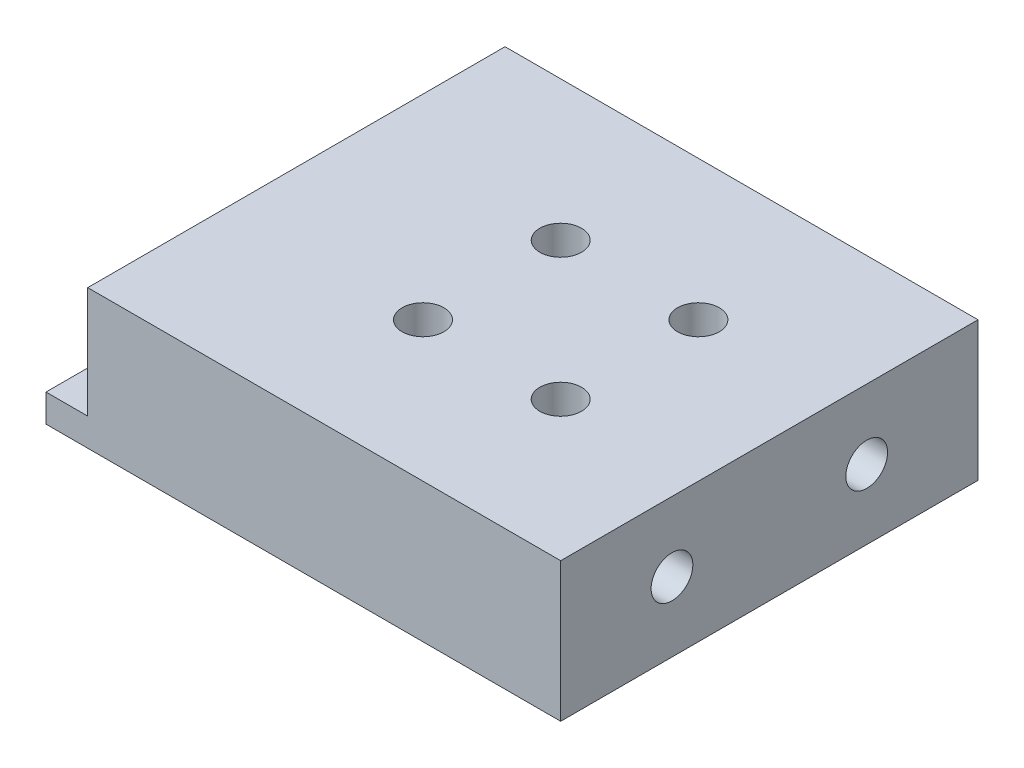
ISO-10303-21;
HEADER;
FILE_DESCRIPTION(('STEP AP214'),'2;1');
FILE_NAME('part.step','',(''),(''),'','','');
FILE_SCHEMA(('AUTOMOTIVE_DESIGN { 1 0 10303 214 1 1 1 1 }'));
ENDSEC;
DATA;
#1=APPLICATION_CONTEXT('core data for automotive mechanical design processes');
#2=APPLICATION_PROTOCOL_DEFINITION('international standard','automotive_design',2000,#1);
#3=PRODUCT_CONTEXT('',#1,'mechanical');
#4=PRODUCT('Part','Part','',(#3));
#5=PRODUCT_RELATED_PRODUCT_CATEGORY('part','',(#4));
#6=PRODUCT_DEFINITION_FORMATION('','',#4);
#7=PRODUCT_DEFINITION_CONTEXT('part definition',#1,'design');
#8=PRODUCT_DEFINITION('design','',#6,#7);
#9=PRODUCT_DEFINITION_SHAPE('','',#8);
#10=(LENGTH_UNIT() NAMED_UNIT(*) SI_UNIT(.MILLI.,.METRE.));
#11=(NAMED_UNIT(*) PLANE_ANGLE_UNIT() SI_UNIT($,.RADIAN.));
#12=(NAMED_UNIT(*) SI_UNIT($,.STERADIAN.) SOLID_ANGLE_UNIT());
#13=UNCERTAINTY_MEASURE_WITH_UNIT(LENGTH_MEASURE(1.E-05),#10,'distance_accuracy_value','');
#14=(GEOMETRIC_REPRESENTATION_CONTEXT(3) GLOBAL_UNCERTAINTY_ASSIGNED_CONTEXT((#13)) GLOBAL_UNIT_ASSIGNED_CONTEXT((#10,
#11,#12)) REPRESENTATION_CONTEXT('',''));
#15=CARTESIAN_POINT('',(0.,0.,0.));
#16=DIRECTION('',(0.,0.,1.));
#17=DIRECTION('',(1.,0.,0.));
#18=AXIS2_PLACEMENT_3D('',#15,#16,#17);
#19=CARTESIAN_POINT('',(0.,10.,0.));
#20=DIRECTION('',(0.,-1.,0.));
#21=DIRECTION('',(0.,0.,-1.));
#22=AXIS2_PLACEMENT_3D('',#19,#20,#21);
#23=PLANE('',#22);
#24=CARTESIAN_POINT('',(17.0502525316942,10.,-10.0502525316941));
#25=DIRECTION('',(0.,1.,0.));
#26=DIRECTION('',(0.,0.,1.));
#27=AXIS2_PLACEMENT_3D('',#24,#25,#26);
#28=CIRCLE('',#27,1.5);
#29=CARTESIAN_POINT('',(17.0502525316942,10.,-8.55025253169414));
#30=VERTEX_POINT('',#29);
#31=EDGE_CURVE('E160',#30,#30,#28,.T.);
#32=ORIENTED_EDGE('',*,*,#31,.F.);
#33=EDGE_LOOP('',(#32));
#34=FACE_BOUND('',#33,.T.);
#35=CARTESIAN_POINT('',(26.9497474683059,10.,-10.0502525316942));
#36=DIRECTION('',(0.,1.,0.));
#37=DIRECTION('',(0.,0.,1.));
#38=AXIS2_PLACEMENT_3D('',#35,#36,#37);
#39=CIRCLE('',#38,1.49999999999992);
#40=CARTESIAN_POINT('',(26.9497474683059,10.,-8.55025253169427));
#41=VERTEX_POINT('',#40);
#42=EDGE_CURVE('E166',#41,#41,#39,.T.);
#43=ORIENTED_EDGE('',*,*,#42,.F.);
#44=EDGE_LOOP('',(#43));
#45=FACE_BOUND('',#44,.T.);
#46=CARTESIAN_POINT('',(17.0502525316941,10.,-19.9497474683058));
#47=DIRECTION('',(0.,1.,0.));
#48=DIRECTION('',(0.,0.,1.));
#49=AXIS2_PLACEMENT_3D('',#46,#47,#48);
#50=CIRCLE('',#49,1.5);
#51=CARTESIAN_POINT('',(17.0502525316941,10.,-18.4497474683058));
#52=VERTEX_POINT('',#51);
#53=EDGE_CURVE('E172',#52,#52,#50,.T.);
#54=ORIENTED_EDGE('',*,*,#53,.F.);
#55=EDGE_LOOP('',(#54));
#56=FACE_BOUND('',#55,.T.);
#57=CARTESIAN_POINT('',(26.9497474683058,10.,-19.9497474683059));
#58=DIRECTION('',(0.,1.,0.));
#59=DIRECTION('',(0.,0.,1.));
#60=AXIS2_PLACEMENT_3D('',#57,#58,#59);
#61=CIRCLE('',#60,1.5);
#62=CARTESIAN_POINT('',(26.9497474683058,10.,-18.4497474683059));
#63=VERTEX_POINT('',#62);
#64=EDGE_CURVE('E107',#63,#63,#61,.T.);
#65=ORIENTED_EDGE('',*,*,#64,.F.);
#66=EDGE_LOOP('',(#65));
#67=FACE_BOUND('',#66,.T.);
#68=DIRECTION('',(0.,0.,-1.));
#69=VECTOR('',#68,1.);
#70=CARTESIAN_POINT('',(3.,10.,-30.));
#71=LINE('',#70,#69);
#72=CARTESIAN_POINT('',(3.,10.,0.));
#73=VERTEX_POINT('',#72);
#74=CARTESIAN_POINT('',(3.,10.,-30.));
#75=VERTEX_POINT('',#74);
#76=EDGE_CURVE('E52',#73,#75,#71,.T.);
#77=ORIENTED_EDGE('',*,*,#76,.F.);
#78=DIRECTION('',(1.,0.,0.));
#79=VECTOR('',#78,1.);
#80=CARTESIAN_POINT('',(0.,10.,0.));
#81=LINE('',#80,#79);
#82=CARTESIAN_POINT('',(37.,10.,0.));
#83=VERTEX_POINT('',#82);
#84=EDGE_CURVE('E100',#73,#83,#81,.T.);
#85=ORIENTED_EDGE('',*,*,#84,.T.);
#86=DIRECTION('',(0.,0.,-1.));
#87=VECTOR('',#86,1.);
#88=CARTESIAN_POINT('',(37.,10.,0.));
#89=LINE('',#88,#87);
#90=CARTESIAN_POINT('',(37.,10.,-30.));
#91=VERTEX_POINT('',#90);
#92=EDGE_CURVE('E61',#83,#91,#89,.T.);
#93=ORIENTED_EDGE('',*,*,#92,.T.);
#94=DIRECTION('',(-1.,0.,0.));
#95=VECTOR('',#94,1.);
#96=CARTESIAN_POINT('',(0.,10.,-30.));
#97=LINE('',#96,#95);
#98=EDGE_CURVE('E91',#91,#75,#97,.T.);
#99=ORIENTED_EDGE('',*,*,#98,.T.);
#100=EDGE_LOOP('',(#77,#85,#93,#99));
#101=FACE_BOUND('',#100,.T.);
#102=ADVANCED_FACE('F35',(#34,#45,#56,#67,#101),#23,.F.);
#103=CARTESIAN_POINT('',(0.,0.,0.));
#104=DIRECTION('',(0.,-1.,0.));
#105=DIRECTION('',(0.,0.,-1.));
#106=AXIS2_PLACEMENT_3D('',#103,#104,#105);
#107=PLANE('',#106);
#108=CARTESIAN_POINT('',(26.9497474683059,0.,-10.0502525316942));
#109=DIRECTION('',(0.,1.,0.));
#110=DIRECTION('',(0.,0.,1.));
#111=AXIS2_PLACEMENT_3D('',#108,#109,#110);
#112=CIRCLE('',#111,1.49999999999992);
#113=CARTESIAN_POINT('',(26.9497474683059,0.,-8.55025253169427));
#114=VERTEX_POINT('',#113);
#115=EDGE_CURVE('E163',#114,#114,#112,.T.);
#116=ORIENTED_EDGE('',*,*,#115,.T.);
#117=EDGE_LOOP('',(#116));
#118=FACE_BOUND('',#117,.T.);
#119=CARTESIAN_POINT('',(26.9497474683058,0.,-19.9497474683059));
#120=DIRECTION('',(0.,1.,0.));
#121=DIRECTION('',(0.,0.,1.));
#122=AXIS2_PLACEMENT_3D('',#119,#120,#121);
#123=CIRCLE('',#122,1.5);
#124=CARTESIAN_POINT('',(26.9497474683058,0.,-18.4497474683059));
#125=VERTEX_POINT('',#124);
#126=EDGE_CURVE('E111',#125,#125,#123,.T.);
#127=ORIENTED_EDGE('',*,*,#126,.T.);
#128=EDGE_LOOP('',(#127));
#129=FACE_BOUND('',#128,.T.);
#130=DIRECTION('',(0.,0.,1.));
#131=VECTOR('',#130,1.);
#132=CARTESIAN_POINT('',(0.,0.,0.));
#133=LINE('',#132,#131);
#134=CARTESIAN_POINT('',(0.,0.,-30.));
#135=VERTEX_POINT('',#134);
#136=CARTESIAN_POINT('',(0.,0.,0.));
#137=VERTEX_POINT('',#136);
#138=EDGE_CURVE('E84',#135,#137,#133,.T.);
#139=ORIENTED_EDGE('',*,*,#138,.F.);
#140=DIRECTION('',(-1.,0.,0.));
#141=VECTOR('',#140,1.);
#142=CARTESIAN_POINT('',(0.,0.,-30.));
#143=LINE('',#142,#141);
#144=CARTESIAN_POINT('',(37.,0.,-30.));
#145=VERTEX_POINT('',#144);
#146=EDGE_CURVE('E95',#145,#135,#143,.T.);
#147=ORIENTED_EDGE('',*,*,#146,.F.);
#148=DIRECTION('',(0.,0.,-1.));
#149=VECTOR('',#148,1.);
#150=CARTESIAN_POINT('',(37.,0.,0.));
#151=LINE('',#150,#149);
#152=CARTESIAN_POINT('',(37.,0.,0.));
#153=VERTEX_POINT('',#152);
#154=EDGE_CURVE('E101',#153,#145,#151,.T.);
#155=ORIENTED_EDGE('',*,*,#154,.F.);
#156=DIRECTION('',(1.,0.,0.));
#157=VECTOR('',#156,1.);
#158=CARTESIAN_POINT('',(0.,0.,0.));
#159=LINE('',#158,#157);
#160=EDGE_CURVE('E106',#137,#153,#159,.T.);
#161=ORIENTED_EDGE('',*,*,#160,.F.);
#162=EDGE_LOOP('',(#139,#147,#155,#161));
#163=FACE_BOUND('',#162,.T.);
#164=CARTESIAN_POINT('',(17.0502525316941,0.,-19.9497474683058));
#165=DIRECTION('',(0.,1.,0.));
#166=DIRECTION('',(0.,0.,1.));
#167=AXIS2_PLACEMENT_3D('',#164,#165,#166);
#168=CIRCLE('',#167,1.5);
#169=CARTESIAN_POINT('',(17.0502525316941,0.,-18.4497474683058));
#170=VERTEX_POINT('',#169);
#171=EDGE_CURVE('E169',#170,#170,#168,.T.);
#172=ORIENTED_EDGE('',*,*,#171,.T.);
#173=EDGE_LOOP('',(#172));
#174=FACE_BOUND('',#173,.T.);
#175=CARTESIAN_POINT('',(17.0502525316942,0.,-10.0502525316941));
#176=DIRECTION('',(0.,1.,0.));
#177=DIRECTION('',(0.,0.,1.));
#178=AXIS2_PLACEMENT_3D('',#175,#176,#177);
#179=CIRCLE('',#178,1.5);
#180=CARTESIAN_POINT('',(17.0502525316942,0.,-8.55025253169414));
#181=VERTEX_POINT('',#180);
#182=EDGE_CURVE('E157',#181,#181,#179,.T.);
#183=ORIENTED_EDGE('',*,*,#182,.T.);
#184=EDGE_LOOP('',(#183));
#185=FACE_BOUND('',#184,.T.);
#186=ADVANCED_FACE('F104',(#118,#129,#163,#174,#185),#107,.T.);
#187=CARTESIAN_POINT('',(0.,10.,0.));
#188=DIRECTION('',(1.,0.,0.));
#189=DIRECTION('',(0.,0.,-1.));
#190=AXIS2_PLACEMENT_3D('',#187,#188,#189);
#191=PLANE('',#190);
#192=DIRECTION('',(0.,-1.,0.));
#193=VECTOR('',#192,1.);
#194=CARTESIAN_POINT('',(0.,10.,0.));
#195=LINE('',#194,#193);
#196=CARTESIAN_POINT('',(0.,2.,0.));
#197=VERTEX_POINT('',#196);
#198=EDGE_CURVE('E11',#197,#137,#195,.T.);
#199=ORIENTED_EDGE('',*,*,#198,.F.);
#200=DIRECTION('',(0.,0.,1.));
#201=VECTOR('',#200,1.);
#202=CARTESIAN_POINT('',(0.,2.,-30.));
#203=LINE('',#202,#201);
#204=CARTESIAN_POINT('',(0.,2.,-30.));
#205=VERTEX_POINT('',#204);
#206=EDGE_CURVE('E87',#205,#197,#203,.T.);
#207=ORIENTED_EDGE('',*,*,#206,.F.);
#208=DIRECTION('',(0.,-1.,0.));
#209=VECTOR('',#208,1.);
#210=CARTESIAN_POINT('',(0.,10.,-30.));
#211=LINE('',#210,#209);
#212=EDGE_CURVE('E80',#205,#135,#211,.T.);
#213=ORIENTED_EDGE('',*,*,#212,.T.);
#214=ORIENTED_EDGE('',*,*,#138,.T.);
#215=EDGE_LOOP('',(#199,#207,#213,#214));
#216=FACE_BOUND('',#215,.T.);
#217=ADVANCED_FACE('F37',(#216),#191,.F.);
#218=CARTESIAN_POINT('',(0.,10.,0.));
#219=DIRECTION('',(0.,0.,-1.));
#220=DIRECTION('',(-1.,0.,0.));
#221=AXIS2_PLACEMENT_3D('',#218,#219,#220);
#222=PLANE('',#221);
#223=DIRECTION('',(0.,1.,0.));
#224=VECTOR('',#223,1.);
#225=CARTESIAN_POINT('',(3.,10.,0.));
#226=LINE('',#225,#224);
#227=CARTESIAN_POINT('',(3.,2.,0.));
#228=VERTEX_POINT('',#227);
#229=EDGE_CURVE('E138',#228,#73,#226,.T.);
#230=ORIENTED_EDGE('',*,*,#229,.F.);
#231=DIRECTION('',(-1.,0.,0.));
#232=VECTOR('',#231,1.);
#233=CARTESIAN_POINT('',(3.,2.,0.));
#234=LINE('',#233,#232);
#235=EDGE_CURVE('E142',#228,#197,#234,.T.);
#236=ORIENTED_EDGE('',*,*,#235,.T.);
#237=ORIENTED_EDGE('',*,*,#198,.T.);
#238=ORIENTED_EDGE('',*,*,#160,.T.);
#239=DIRECTION('',(0.,-1.,0.));
#240=VECTOR('',#239,1.);
#241=CARTESIAN_POINT('',(37.,10.,0.));
#242=LINE('',#241,#240);
#243=EDGE_CURVE('E44',#83,#153,#242,.T.);
#244=ORIENTED_EDGE('',*,*,#243,.F.);
#245=ORIENTED_EDGE('',*,*,#84,.F.);
#246=EDGE_LOOP('',(#230,#236,#237,#238,#244,#245));
#247=FACE_BOUND('',#246,.T.);
#248=ADVANCED_FACE('F194',(#247),#222,.F.);
#249=CARTESIAN_POINT('',(37.,10.,0.));
#250=DIRECTION('',(-1.,0.,0.));
#251=DIRECTION('',(0.,0.,1.));
#252=AXIS2_PLACEMENT_3D('',#249,#250,#251);
#253=PLANE('',#252);
#254=CARTESIAN_POINT('',(37.,5.,-22.));
#255=DIRECTION('',(1.,0.,0.));
#256=DIRECTION('',(0.,0.,-1.));
#257=AXIS2_PLACEMENT_3D('',#254,#255,#256);
#258=CIRCLE('',#257,1.5);
#259=CARTESIAN_POINT('',(37.,5.,-23.5));
#260=VERTEX_POINT('',#259);
#261=EDGE_CURVE('E145',#260,#260,#258,.T.);
#262=ORIENTED_EDGE('',*,*,#261,.F.);
#263=EDGE_LOOP('',(#262));
#264=FACE_BOUND('',#263,.T.);
#265=CARTESIAN_POINT('',(37.,5.,-8.));
#266=DIRECTION('',(1.,0.,0.));
#267=DIRECTION('',(0.,0.,-1.));
#268=AXIS2_PLACEMENT_3D('',#265,#266,#267);
#269=CIRCLE('',#268,1.5);
#270=CARTESIAN_POINT('',(37.,5.,-9.5));
#271=VERTEX_POINT('',#270);
#272=EDGE_CURVE('E151',#271,#271,#269,.T.);
#273=ORIENTED_EDGE('',*,*,#272,.F.);
#274=EDGE_LOOP('',(#273));
#275=FACE_BOUND('',#274,.T.);
#276=ORIENTED_EDGE('',*,*,#154,.T.);
#277=DIRECTION('',(0.,-1.,0.));
#278=VECTOR('',#277,1.);
#279=CARTESIAN_POINT('',(37.,10.,-30.));
#280=LINE('',#279,#278);
#281=EDGE_CURVE('E90',#91,#145,#280,.T.);
#282=ORIENTED_EDGE('',*,*,#281,.F.);
#283=ORIENTED_EDGE('',*,*,#92,.F.);
#284=ORIENTED_EDGE('',*,*,#243,.T.);
#285=EDGE_LOOP('',(#276,#282,#283,#284));
#286=FACE_BOUND('',#285,.T.);
#287=ADVANCED_FACE('F197',(#264,#275,#286),#253,.F.);
#288=CARTESIAN_POINT('',(0.,10.,-30.));
#289=DIRECTION('',(0.,0.,1.));
#290=DIRECTION('',(1.,0.,0.));
#291=AXIS2_PLACEMENT_3D('',#288,#289,#290);
#292=PLANE('',#291);
#293=ORIENTED_EDGE('',*,*,#212,.F.);
#294=DIRECTION('',(-1.,0.,0.));
#295=VECTOR('',#294,1.);
#296=CARTESIAN_POINT('',(3.,2.,-30.));
#297=LINE('',#296,#295);
#298=CARTESIAN_POINT('',(3.,2.,-30.));
#299=VERTEX_POINT('',#298);
#300=EDGE_CURVE('E140',#299,#205,#297,.T.);
#301=ORIENTED_EDGE('',*,*,#300,.F.);
#302=DIRECTION('',(0.,-1.,0.));
#303=VECTOR('',#302,1.);
#304=CARTESIAN_POINT('',(3.,10.,-30.));
#305=LINE('',#304,#303);
#306=EDGE_CURVE('E124',#75,#299,#305,.T.);
#307=ORIENTED_EDGE('',*,*,#306,.F.);
#308=ORIENTED_EDGE('',*,*,#98,.F.);
#309=ORIENTED_EDGE('',*,*,#281,.T.);
#310=ORIENTED_EDGE('',*,*,#146,.T.);
#311=EDGE_LOOP('',(#293,#301,#307,#308,#309,#310));
#312=FACE_BOUND('',#311,.T.);
#313=ADVANCED_FACE('F96',(#312),#292,.F.);
#314=CARTESIAN_POINT('',(26.9497474683058,10.,-19.9497474683059));
#315=DIRECTION('',(0.,-1.,0.));
#316=DIRECTION('',(0.,0.,-1.));
#317=AXIS2_PLACEMENT_3D('',#314,#315,#316);
#318=CYLINDRICAL_SURFACE('',#317,1.5);
#319=ORIENTED_EDGE('',*,*,#64,.T.);
#320=EDGE_LOOP('',(#319));
#321=FACE_BOUND('',#320,.T.);
#322=ORIENTED_EDGE('',*,*,#126,.F.);
#323=EDGE_LOOP('',(#322));
#324=FACE_BOUND('',#323,.T.);
#325=ADVANCED_FACE('F205',(#321,#324),#318,.F.);
#326=CARTESIAN_POINT('',(17.0502525316941,10.,-19.9497474683058));
#327=DIRECTION('',(0.,-1.,0.));
#328=DIRECTION('',(0.,0.,-1.));
#329=AXIS2_PLACEMENT_3D('',#326,#327,#328);
#330=CYLINDRICAL_SURFACE('',#329,1.5);
#331=ORIENTED_EDGE('',*,*,#53,.T.);
#332=EDGE_LOOP('',(#331));
#333=FACE_BOUND('',#332,.T.);
#334=ORIENTED_EDGE('',*,*,#171,.F.);
#335=EDGE_LOOP('',(#334));
#336=FACE_BOUND('',#335,.T.);
#337=ADVANCED_FACE('F222',(#333,#336),#330,.F.);
#338=CARTESIAN_POINT('',(26.9497474683059,10.,-10.0502525316942));
#339=DIRECTION('',(0.,-1.,0.));
#340=DIRECTION('',(0.,0.,-1.));
#341=AXIS2_PLACEMENT_3D('',#338,#339,#340);
#342=CYLINDRICAL_SURFACE('',#341,1.49999999999992);
#343=ORIENTED_EDGE('',*,*,#42,.T.);
#344=EDGE_LOOP('',(#343));
#345=FACE_BOUND('',#344,.T.);
#346=ORIENTED_EDGE('',*,*,#115,.F.);
#347=EDGE_LOOP('',(#346));
#348=FACE_BOUND('',#347,.T.);
#349=ADVANCED_FACE('F226',(#345,#348),#342,.F.);
#350=CARTESIAN_POINT('',(17.0502525316942,10.,-10.0502525316941));
#351=DIRECTION('',(0.,-1.,0.));
#352=DIRECTION('',(0.,0.,-1.));
#353=AXIS2_PLACEMENT_3D('',#350,#351,#352);
#354=CYLINDRICAL_SURFACE('',#353,1.5);
#355=ORIENTED_EDGE('',*,*,#31,.T.);
#356=EDGE_LOOP('',(#355));
#357=FACE_BOUND('',#356,.T.);
#358=ORIENTED_EDGE('',*,*,#182,.F.);
#359=EDGE_LOOP('',(#358));
#360=FACE_BOUND('',#359,.T.);
#361=ADVANCED_FACE('F230',(#357,#360),#354,.F.);
#362=CARTESIAN_POINT('',(31.,5.,-8.));
#363=DIRECTION('',(1.,0.,0.));
#364=DIRECTION('',(0.,0.,-1.));
#365=AXIS2_PLACEMENT_3D('',#362,#363,#364);
#366=CYLINDRICAL_SURFACE('',#365,1.5);
#367=CARTESIAN_POINT('',(31.,5.,-8.));
#368=DIRECTION('',(1.,0.,0.));
#369=DIRECTION('',(0.,0.,-1.));
#370=AXIS2_PLACEMENT_3D('',#367,#368,#369);
#371=CIRCLE('',#370,1.5);
#372=CARTESIAN_POINT('',(31.,5.,-9.5));
#373=VERTEX_POINT('',#372);
#374=EDGE_CURVE('E154',#373,#373,#371,.T.);
#375=ORIENTED_EDGE('',*,*,#374,.F.);
#376=EDGE_LOOP('',(#375));
#377=FACE_BOUND('',#376,.T.);
#378=ORIENTED_EDGE('',*,*,#272,.T.);
#379=EDGE_LOOP('',(#378));
#380=FACE_BOUND('',#379,.T.);
#381=ADVANCED_FACE('F234',(#377,#380),#366,.F.);
#382=CARTESIAN_POINT('',(31.,5.,-8.));
#383=DIRECTION('',(1.,0.,0.));
#384=DIRECTION('',(0.,0.,-1.));
#385=AXIS2_PLACEMENT_3D('',#382,#383,#384);
#386=PLANE('',#385);
#387=ORIENTED_EDGE('',*,*,#374,.T.);
#388=EDGE_LOOP('',(#387));
#389=FACE_BOUND('',#388,.T.);
#390=ADVANCED_FACE('F238',(#389),#386,.T.);
#391=CARTESIAN_POINT('',(31.,5.,-22.));
#392=DIRECTION('',(1.,0.,0.));
#393=DIRECTION('',(0.,0.,-1.));
#394=AXIS2_PLACEMENT_3D('',#391,#392,#393);
#395=CYLINDRICAL_SURFACE('',#394,1.5);
#396=CARTESIAN_POINT('',(31.,5.,-22.));
#397=DIRECTION('',(1.,0.,0.));
#398=DIRECTION('',(0.,0.,-1.));
#399=AXIS2_PLACEMENT_3D('',#396,#397,#398);
#400=CIRCLE('',#399,1.5);
#401=CARTESIAN_POINT('',(31.,5.,-23.5));
#402=VERTEX_POINT('',#401);
#403=EDGE_CURVE('E148',#402,#402,#400,.T.);
#404=ORIENTED_EDGE('',*,*,#403,.F.);
#405=EDGE_LOOP('',(#404));
#406=FACE_BOUND('',#405,.T.);
#407=ORIENTED_EDGE('',*,*,#261,.T.);
#408=EDGE_LOOP('',(#407));
#409=FACE_BOUND('',#408,.T.);
#410=ADVANCED_FACE('F242',(#406,#409),#395,.F.);
#411=CARTESIAN_POINT('',(31.,5.,-22.));
#412=DIRECTION('',(1.,0.,0.));
#413=DIRECTION('',(0.,0.,-1.));
#414=AXIS2_PLACEMENT_3D('',#411,#412,#413);
#415=PLANE('',#414);
#416=ORIENTED_EDGE('',*,*,#403,.T.);
#417=EDGE_LOOP('',(#416));
#418=FACE_BOUND('',#417,.T.);
#419=ADVANCED_FACE('F246',(#418),#415,.T.);
#420=CARTESIAN_POINT('',(3.,2.,-30.));
#421=DIRECTION('',(0.,-1.,0.));
#422=DIRECTION('',(0.,0.,-1.));
#423=AXIS2_PLACEMENT_3D('',#420,#421,#422);
#424=PLANE('',#423);
#425=ORIENTED_EDGE('',*,*,#206,.T.);
#426=ORIENTED_EDGE('',*,*,#235,.F.);
#427=DIRECTION('',(0.,0.,1.));
#428=VECTOR('',#427,1.);
#429=CARTESIAN_POINT('',(3.,2.,-30.));
#430=LINE('',#429,#428);
#431=EDGE_CURVE('E135',#299,#228,#430,.T.);
#432=ORIENTED_EDGE('',*,*,#431,.F.);
#433=ORIENTED_EDGE('',*,*,#300,.T.);
#434=EDGE_LOOP('',(#425,#426,#432,#433));
#435=FACE_BOUND('',#434,.T.);
#436=ADVANCED_FACE('F192',(#435),#424,.F.);
#437=CARTESIAN_POINT('',(3.,0.,0.));
#438=DIRECTION('',(-1.,0.,0.));
#439=DIRECTION('',(0.,0.,1.));
#440=AXIS2_PLACEMENT_3D('',#437,#438,#439);
#441=PLANE('',#440);
#442=CARTESIAN_POINT('',(3.,5.4,-10.));
#443=DIRECTION('',(-1.,0.,0.));
#444=DIRECTION('',(0.,0.,1.));
#445=AXIS2_PLACEMENT_3D('',#442,#443,#444);
#446=CIRCLE('',#445,1.);
#447=CARTESIAN_POINT('',(3.,5.4,-9.));
#448=VERTEX_POINT('',#447);
#449=EDGE_CURVE('E39',#448,#448,#446,.T.);
#450=ORIENTED_EDGE('',*,*,#449,.F.);
#451=EDGE_LOOP('',(#450));
#452=FACE_BOUND('',#451,.T.);
#453=CARTESIAN_POINT('',(3.,5.4,-20.));
#454=DIRECTION('',(-1.,0.,0.));
#455=DIRECTION('',(0.,0.,1.));
#456=AXIS2_PLACEMENT_3D('',#453,#454,#455);
#457=CIRCLE('',#456,1.);
#458=CARTESIAN_POINT('',(3.,5.4,-19.));
#459=VERTEX_POINT('',#458);
#460=EDGE_CURVE('E119',#459,#459,#457,.T.);
#461=ORIENTED_EDGE('',*,*,#460,.F.);
#462=EDGE_LOOP('',(#461));
#463=FACE_BOUND('',#462,.T.);
#464=ORIENTED_EDGE('',*,*,#306,.T.);
#465=ORIENTED_EDGE('',*,*,#431,.T.);
#466=ORIENTED_EDGE('',*,*,#229,.T.);
#467=ORIENTED_EDGE('',*,*,#76,.T.);
#468=EDGE_LOOP('',(#464,#465,#466,#467));
#469=FACE_BOUND('',#468,.T.);
#470=ADVANCED_FACE('F181',(#452,#463,#469),#441,.T.);
#471=CARTESIAN_POINT('',(7.,5.4,-20.));
#472=DIRECTION('',(-1.,0.,0.));
#473=DIRECTION('',(0.,0.,1.));
#474=AXIS2_PLACEMENT_3D('',#471,#472,#473);
#475=CYLINDRICAL_SURFACE('',#474,1.);
#476=ORIENTED_EDGE('',*,*,#460,.T.);
#477=EDGE_LOOP('',(#476));
#478=FACE_BOUND('',#477,.T.);
#479=CARTESIAN_POINT('',(7.,5.4,-20.));
#480=DIRECTION('',(-1.,0.,0.));
#481=DIRECTION('',(0.,0.,1.));
#482=AXIS2_PLACEMENT_3D('',#479,#480,#481);
#483=CIRCLE('',#482,1.);
#484=CARTESIAN_POINT('',(7.,5.4,-19.));
#485=VERTEX_POINT('',#484);
#486=EDGE_CURVE('E121',#485,#485,#483,.T.);
#487=ORIENTED_EDGE('',*,*,#486,.F.);
#488=EDGE_LOOP('',(#487));
#489=FACE_BOUND('',#488,.T.);
#490=ADVANCED_FACE('F255',(#478,#489),#475,.F.);
#491=CARTESIAN_POINT('',(7.,5.4,-20.));
#492=DIRECTION('',(-1.,0.,0.));
#493=DIRECTION('',(0.,0.,1.));
#494=AXIS2_PLACEMENT_3D('',#491,#492,#493);
#495=PLANE('',#494);
#496=ORIENTED_EDGE('',*,*,#486,.T.);
#497=EDGE_LOOP('',(#496));
#498=FACE_BOUND('',#497,.T.);
#499=ADVANCED_FACE('F259',(#498),#495,.T.);
#500=CARTESIAN_POINT('',(7.,5.4,-10.));
#501=DIRECTION('',(-1.,0.,0.));
#502=DIRECTION('',(0.,0.,1.));
#503=AXIS2_PLACEMENT_3D('',#500,#501,#502);
#504=CYLINDRICAL_SURFACE('',#503,1.);
#505=ORIENTED_EDGE('',*,*,#449,.T.);
#506=EDGE_LOOP('',(#505));
#507=FACE_BOUND('',#506,.T.);
#508=CARTESIAN_POINT('',(7.,5.4,-10.));
#509=DIRECTION('',(-1.,0.,0.));
#510=DIRECTION('',(0.,0.,1.));
#511=AXIS2_PLACEMENT_3D('',#508,#509,#510);
#512=CIRCLE('',#511,1.);
#513=CARTESIAN_POINT('',(7.,5.4,-9.));
#514=VERTEX_POINT('',#513);
#515=EDGE_CURVE('E131',#514,#514,#512,.T.);
#516=ORIENTED_EDGE('',*,*,#515,.F.);
#517=EDGE_LOOP('',(#516));
#518=FACE_BOUND('',#517,.T.);
#519=ADVANCED_FACE('F262',(#507,#518),#504,.F.);
#520=CARTESIAN_POINT('',(7.,5.4,-10.));
#521=DIRECTION('',(-1.,0.,0.));
#522=DIRECTION('',(0.,0.,1.));
#523=AXIS2_PLACEMENT_3D('',#520,#521,#522);
#524=PLANE('',#523);
#525=ORIENTED_EDGE('',*,*,#515,.T.);
#526=EDGE_LOOP('',(#525));
#527=FACE_BOUND('',#526,.T.);
#528=ADVANCED_FACE('F265',(#527),#524,.T.);
#529=CLOSED_SHELL('',(#102,#186,#217,#248,#287,#313,#325,#337,#349,#361,#381,#390,#410,#419,
#436,#470,#490,#499,#519,#528));
#530=MANIFOLD_SOLID_BREP('B2',#529);
#531=ADVANCED_BREP_SHAPE_REPRESENTATION('',(#18,#530),#14);
#532=SHAPE_DEFINITION_REPRESENTATION(#9,#531);
ENDSEC;
END-ISO-10303-21;
